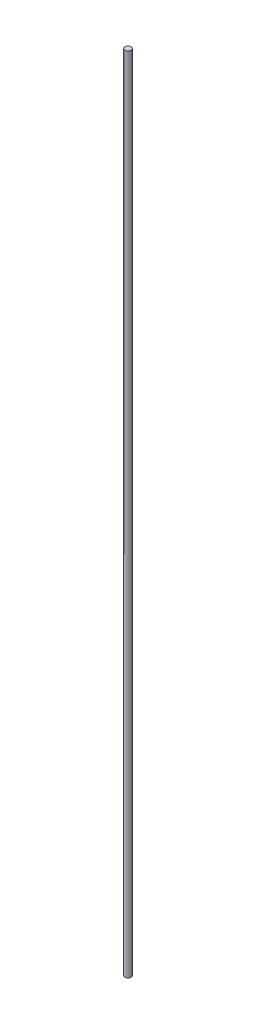
ISO-10303-21;
HEADER;
FILE_DESCRIPTION(('STEP AP214'),'2;1');
FILE_NAME('part.step','',(''),(''),'','','');
FILE_SCHEMA(('AUTOMOTIVE_DESIGN { 1 0 10303 214 1 1 1 1 }'));
ENDSEC;
DATA;
#1=APPLICATION_CONTEXT('core data for automotive mechanical design processes');
#2=APPLICATION_PROTOCOL_DEFINITION('international standard','automotive_design',2000,#1);
#3=PRODUCT_CONTEXT('',#1,'mechanical');
#4=PRODUCT('Part','Part','',(#3));
#5=PRODUCT_RELATED_PRODUCT_CATEGORY('part','',(#4));
#6=PRODUCT_DEFINITION_FORMATION('','',#4);
#7=PRODUCT_DEFINITION_CONTEXT('part definition',#1,'design');
#8=PRODUCT_DEFINITION('design','',#6,#7);
#9=PRODUCT_DEFINITION_SHAPE('','',#8);
#10=(LENGTH_UNIT() NAMED_UNIT(*) SI_UNIT(.MILLI.,.METRE.));
#11=(NAMED_UNIT(*) PLANE_ANGLE_UNIT() SI_UNIT($,.RADIAN.));
#12=(NAMED_UNIT(*) SI_UNIT($,.STERADIAN.) SOLID_ANGLE_UNIT());
#13=UNCERTAINTY_MEASURE_WITH_UNIT(LENGTH_MEASURE(1.E-05),#10,'distance_accuracy_value','');
#14=(GEOMETRIC_REPRESENTATION_CONTEXT(3) GLOBAL_UNCERTAINTY_ASSIGNED_CONTEXT((#13)) GLOBAL_UNIT_ASSIGNED_CONTEXT((#10,
#11,#12)) REPRESENTATION_CONTEXT('',''));
#15=CARTESIAN_POINT('',(0.,0.,0.));
#16=DIRECTION('',(0.,0.,1.));
#17=DIRECTION('',(1.,0.,0.));
#18=AXIS2_PLACEMENT_3D('',#15,#16,#17);
#19=CARTESIAN_POINT('',(0.,520.,0.));
#20=DIRECTION('',(0.,-1.,0.));
#21=DIRECTION('',(0.,0.,-1.));
#22=AXIS2_PLACEMENT_3D('',#19,#20,#21);
#23=CYLINDRICAL_SURFACE('',#22,2.);
#24=CARTESIAN_POINT('',(0.,520.,0.));
#25=DIRECTION('',(0.,1.,0.));
#26=DIRECTION('',(0.,0.,1.));
#27=AXIS2_PLACEMENT_3D('',#24,#25,#26);
#28=CIRCLE('',#27,2.);
#29=CARTESIAN_POINT('',(0.,520.,2.));
#30=VERTEX_POINT('',#29);
#31=EDGE_CURVE('E10',#30,#30,#28,.T.);
#32=ORIENTED_EDGE('',*,*,#31,.F.);
#33=EDGE_LOOP('',(#32));
#34=FACE_BOUND('',#33,.T.);
#35=CARTESIAN_POINT('',(0.,0.,0.));
#36=DIRECTION('',(0.,1.,0.));
#37=DIRECTION('',(0.,0.,1.));
#38=AXIS2_PLACEMENT_3D('',#35,#36,#37);
#39=CIRCLE('',#38,2.);
#40=CARTESIAN_POINT('',(0.,0.,2.));
#41=VERTEX_POINT('',#40);
#42=EDGE_CURVE('E45',#41,#41,#39,.T.);
#43=ORIENTED_EDGE('',*,*,#42,.T.);
#44=EDGE_LOOP('',(#43));
#45=FACE_BOUND('',#44,.T.);
#46=ADVANCED_FACE('F42',(#34,#45),#23,.T.);
#47=CARTESIAN_POINT('',(0.,520.,0.));
#48=DIRECTION('',(0.,1.,0.));
#49=DIRECTION('',(0.,0.,1.));
#50=AXIS2_PLACEMENT_3D('',#47,#48,#49);
#51=PLANE('',#50);
#52=ORIENTED_EDGE('',*,*,#31,.T.);
#53=EDGE_LOOP('',(#52));
#54=FACE_BOUND('',#53,.T.);
#55=ADVANCED_FACE('F59',(#54),#51,.T.);
#56=CARTESIAN_POINT('',(0.,0.,0.));
#57=DIRECTION('',(0.,1.,0.));
#58=DIRECTION('',(0.,0.,1.));
#59=AXIS2_PLACEMENT_3D('',#56,#57,#58);
#60=PLANE('',#59);
#61=ORIENTED_EDGE('',*,*,#42,.F.);
#62=EDGE_LOOP('',(#61));
#63=FACE_BOUND('',#62,.T.);
#64=ADVANCED_FACE('F57',(#63),#60,.F.);
#65=CLOSED_SHELL('',(#46,#55,#64));
#66=MANIFOLD_SOLID_BREP('B2',#65);
#67=ADVANCED_BREP_SHAPE_REPRESENTATION('',(#18,#66),#14);
#68=SHAPE_DEFINITION_REPRESENTATION(#9,#67);
ENDSEC;
END-ISO-10303-21;
